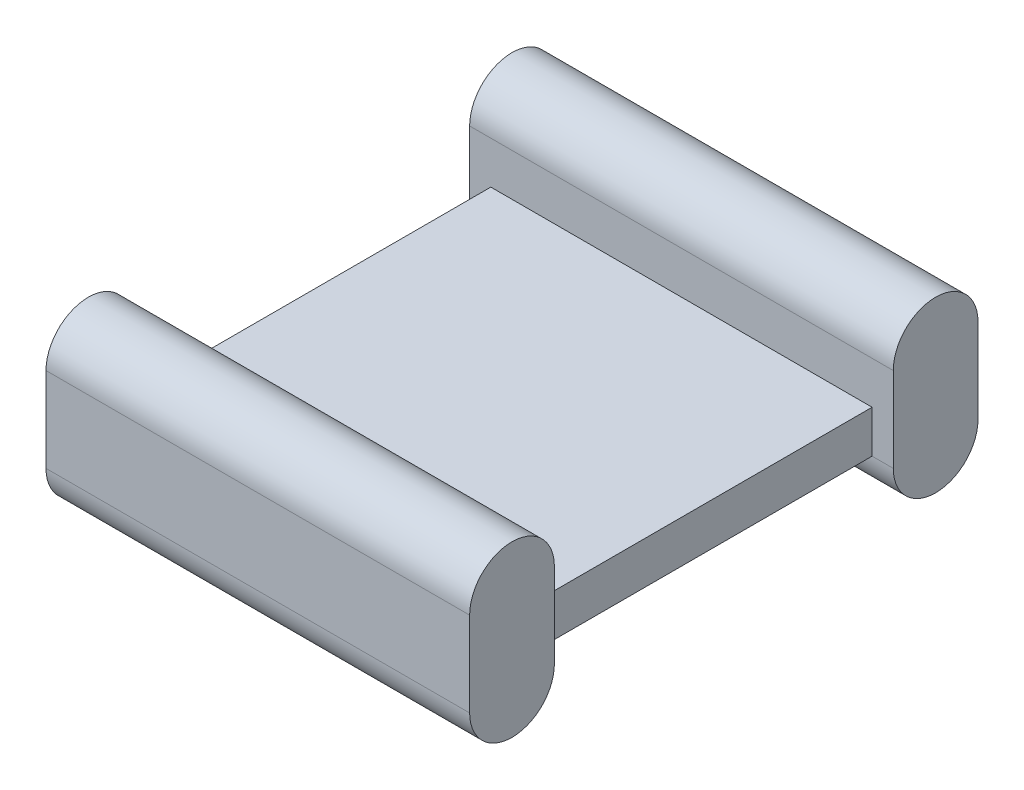
ISO-10303-21;
HEADER;
FILE_DESCRIPTION(('STEP AP214'),'2;1');
FILE_NAME('part.step','',(''),(''),'','','');
FILE_SCHEMA(('AUTOMOTIVE_DESIGN { 1 0 10303 214 1 1 1 1 }'));
ENDSEC;
DATA;
#1=APPLICATION_CONTEXT('core data for automotive mechanical design processes');
#2=APPLICATION_PROTOCOL_DEFINITION('international standard','automotive_design',2000,#1);
#3=PRODUCT_CONTEXT('',#1,'mechanical');
#4=PRODUCT('Part','Part','',(#3));
#5=PRODUCT_RELATED_PRODUCT_CATEGORY('part','',(#4));
#6=PRODUCT_DEFINITION_FORMATION('','',#4);
#7=PRODUCT_DEFINITION_CONTEXT('part definition',#1,'design');
#8=PRODUCT_DEFINITION('design','',#6,#7);
#9=PRODUCT_DEFINITION_SHAPE('','',#8);
#10=(LENGTH_UNIT() NAMED_UNIT(*) SI_UNIT(.MILLI.,.METRE.));
#11=(NAMED_UNIT(*) PLANE_ANGLE_UNIT() SI_UNIT($,.RADIAN.));
#12=(NAMED_UNIT(*) SI_UNIT($,.STERADIAN.) SOLID_ANGLE_UNIT());
#13=UNCERTAINTY_MEASURE_WITH_UNIT(LENGTH_MEASURE(1.E-05),#10,'distance_accuracy_value','');
#14=(GEOMETRIC_REPRESENTATION_CONTEXT(3) GLOBAL_UNCERTAINTY_ASSIGNED_CONTEXT((#13)) GLOBAL_UNIT_ASSIGNED_CONTEXT((#10,
#11,#12)) REPRESENTATION_CONTEXT('',''));
#15=CARTESIAN_POINT('',(0.,0.,0.));
#16=DIRECTION('',(0.,0.,1.));
#17=DIRECTION('',(1.,0.,0.));
#18=AXIS2_PLACEMENT_3D('',#15,#16,#17);
#19=CARTESIAN_POINT('',(-114.3,12.7,152.4));
#20=DIRECTION('',(1.,0.,0.));
#21=DIRECTION('',(0.,0.,-1.));
#22=AXIS2_PLACEMENT_3D('',#19,#20,#21);
#23=PLANE('',#22);
#24=DIRECTION('',(0.,1.,0.));
#25=VECTOR('',#24,1.);
#26=CARTESIAN_POINT('',(-114.3,12.7,-101.6));
#27=LINE('',#26,#25);
#28=CARTESIAN_POINT('',(-114.3,-12.7,-101.6));
#29=VERTEX_POINT('',#28);
#30=CARTESIAN_POINT('',(-114.3,12.7,-101.6));
#31=VERTEX_POINT('',#30);
#32=EDGE_CURVE('E172',#29,#31,#27,.T.);
#33=ORIENTED_EDGE('',*,*,#32,.F.);
#34=DIRECTION('',(0.,0.,1.));
#35=VECTOR('',#34,1.);
#36=CARTESIAN_POINT('',(-114.3,-12.7,152.4));
#37=LINE('',#36,#35);
#38=CARTESIAN_POINT('',(-114.3,-12.7,101.6));
#39=VERTEX_POINT('',#38);
#40=EDGE_CURVE('E213',#29,#39,#37,.T.);
#41=ORIENTED_EDGE('',*,*,#40,.T.);
#42=DIRECTION('',(0.,-1.,0.));
#43=VECTOR('',#42,1.);
#44=CARTESIAN_POINT('',(-114.3,12.7,101.6));
#45=LINE('',#44,#43);
#46=CARTESIAN_POINT('',(-114.3,12.7,101.6));
#47=VERTEX_POINT('',#46);
#48=EDGE_CURVE('E210',#47,#39,#45,.T.);
#49=ORIENTED_EDGE('',*,*,#48,.F.);
#50=DIRECTION('',(0.,0.,1.));
#51=VECTOR('',#50,1.);
#52=CARTESIAN_POINT('',(-114.3,12.7,152.4));
#53=LINE('',#52,#51);
#54=EDGE_CURVE('E135',#31,#47,#53,.T.);
#55=ORIENTED_EDGE('',*,*,#54,.F.);
#56=EDGE_LOOP('',(#33,#41,#49,#55));
#57=FACE_BOUND('',#56,.T.);
#58=ADVANCED_FACE('F35',(#57),#23,.F.);
#59=CARTESIAN_POINT('',(114.3,12.7,152.4));
#60=DIRECTION('',(-1.,0.,0.));
#61=DIRECTION('',(0.,0.,1.));
#62=AXIS2_PLACEMENT_3D('',#59,#60,#61);
#63=PLANE('',#62);
#64=DIRECTION('',(0.,-1.,0.));
#65=VECTOR('',#64,1.);
#66=CARTESIAN_POINT('',(114.3,12.7,-101.6));
#67=LINE('',#66,#65);
#68=CARTESIAN_POINT('',(114.3,12.7,-101.6));
#69=VERTEX_POINT('',#68);
#70=CARTESIAN_POINT('',(114.3,-12.7,-101.6));
#71=VERTEX_POINT('',#70);
#72=EDGE_CURVE('E49',#69,#71,#67,.T.);
#73=ORIENTED_EDGE('',*,*,#72,.F.);
#74=DIRECTION('',(0.,0.,-1.));
#75=VECTOR('',#74,1.);
#76=CARTESIAN_POINT('',(114.3,12.7,152.4));
#77=LINE('',#76,#75);
#78=CARTESIAN_POINT('',(114.3,12.7,101.6));
#79=VERTEX_POINT('',#78);
#80=EDGE_CURVE('E42',#79,#69,#77,.T.);
#81=ORIENTED_EDGE('',*,*,#80,.F.);
#82=DIRECTION('',(0.,1.,0.));
#83=VECTOR('',#82,1.);
#84=CARTESIAN_POINT('',(114.3,12.7,101.6));
#85=LINE('',#84,#83);
#86=CARTESIAN_POINT('',(114.3,-12.7,101.6));
#87=VERTEX_POINT('',#86);
#88=EDGE_CURVE('E207',#87,#79,#85,.T.);
#89=ORIENTED_EDGE('',*,*,#88,.F.);
#90=DIRECTION('',(0.,0.,-1.));
#91=VECTOR('',#90,1.);
#92=CARTESIAN_POINT('',(114.3,-12.7,152.4));
#93=LINE('',#92,#91);
#94=EDGE_CURVE('E136',#87,#71,#93,.T.);
#95=ORIENTED_EDGE('',*,*,#94,.T.);
#96=EDGE_LOOP('',(#73,#81,#89,#95));
#97=FACE_BOUND('',#96,.T.);
#98=ADVANCED_FACE('F220',(#97),#63,.F.);
#99=CARTESIAN_POINT('',(0.,12.7,0.));
#100=DIRECTION('',(0.,1.,0.));
#101=DIRECTION('',(0.,0.,1.));
#102=AXIS2_PLACEMENT_3D('',#99,#100,#101);
#103=PLANE('',#102);
#104=ORIENTED_EDGE('',*,*,#80,.T.);
#105=DIRECTION('',(-1.,0.,0.));
#106=VECTOR('',#105,1.);
#107=CARTESIAN_POINT('',(0.,12.7,-101.6));
#108=LINE('',#107,#106);
#109=EDGE_CURVE('E56',#69,#31,#108,.T.);
#110=ORIENTED_EDGE('',*,*,#109,.T.);
#111=ORIENTED_EDGE('',*,*,#54,.T.);
#112=DIRECTION('',(1.,0.,0.));
#113=VECTOR('',#112,1.);
#114=CARTESIAN_POINT('',(0.,12.7,101.6));
#115=LINE('',#114,#113);
#116=EDGE_CURVE('E205',#47,#79,#115,.T.);
#117=ORIENTED_EDGE('',*,*,#116,.T.);
#118=EDGE_LOOP('',(#104,#110,#111,#117));
#119=FACE_BOUND('',#118,.T.);
#120=ADVANCED_FACE('F251',(#119),#103,.T.);
#121=CARTESIAN_POINT('',(0.,-12.7,0.));
#122=DIRECTION('',(0.,1.,0.));
#123=DIRECTION('',(0.,0.,1.));
#124=AXIS2_PLACEMENT_3D('',#121,#122,#123);
#125=PLANE('',#124);
#126=DIRECTION('',(-1.,0.,0.));
#127=VECTOR('',#126,1.);
#128=CARTESIAN_POINT('',(127.,-12.7,-101.6));
#129=LINE('',#128,#127);
#130=EDGE_CURVE('E166',#71,#29,#129,.T.);
#131=ORIENTED_EDGE('',*,*,#130,.F.);
#132=ORIENTED_EDGE('',*,*,#94,.F.);
#133=DIRECTION('',(1.,0.,0.));
#134=VECTOR('',#133,1.);
#135=CARTESIAN_POINT('',(0.,-12.7,101.6));
#136=LINE('',#135,#134);
#137=EDGE_CURVE('E11',#39,#87,#136,.T.);
#138=ORIENTED_EDGE('',*,*,#137,.F.);
#139=ORIENTED_EDGE('',*,*,#40,.F.);
#140=EDGE_LOOP('',(#131,#132,#138,#139));
#141=FACE_BOUND('',#140,.T.);
#142=ADVANCED_FACE('F227',(#141),#125,.F.);
#143=CARTESIAN_POINT('',(127.,-12.7,101.6));
#144=DIRECTION('',(0.,0.,1.));
#145=DIRECTION('',(1.,0.,0.));
#146=AXIS2_PLACEMENT_3D('',#143,#144,#145);
#147=PLANE('',#146);
#148=ORIENTED_EDGE('',*,*,#116,.F.);
#149=ORIENTED_EDGE('',*,*,#48,.T.);
#150=DIRECTION('',(-1.,0.,0.));
#151=VECTOR('',#150,1.);
#152=CARTESIAN_POINT('',(127.,-12.7,101.6));
#153=LINE('',#152,#151);
#154=CARTESIAN_POINT('',(-127.,-12.7,101.6));
#155=VERTEX_POINT('',#154);
#156=EDGE_CURVE('E201',#39,#155,#153,.T.);
#157=ORIENTED_EDGE('',*,*,#156,.T.);
#158=DIRECTION('',(0.,1.,0.));
#159=VECTOR('',#158,1.);
#160=CARTESIAN_POINT('',(-127.,-12.7,101.6));
#161=LINE('',#160,#159);
#162=CARTESIAN_POINT('',(-127.,38.1,101.6));
#163=VERTEX_POINT('',#162);
#164=EDGE_CURVE('E190',#155,#163,#161,.T.);
#165=ORIENTED_EDGE('',*,*,#164,.T.);
#166=DIRECTION('',(-1.,0.,0.));
#167=VECTOR('',#166,1.);
#168=CARTESIAN_POINT('',(127.,38.1,101.6));
#169=LINE('',#168,#167);
#170=CARTESIAN_POINT('',(127.,38.1,101.6));
#171=VERTEX_POINT('',#170);
#172=EDGE_CURVE('E198',#171,#163,#169,.T.);
#173=ORIENTED_EDGE('',*,*,#172,.F.);
#174=DIRECTION('',(0.,1.,0.));
#175=VECTOR('',#174,1.);
#176=CARTESIAN_POINT('',(127.,-12.7,101.6));
#177=LINE('',#176,#175);
#178=CARTESIAN_POINT('',(127.,-12.7,101.6));
#179=VERTEX_POINT('',#178);
#180=EDGE_CURVE('E179',#179,#171,#177,.T.);
#181=ORIENTED_EDGE('',*,*,#180,.F.);
#182=EDGE_CURVE('E202',#179,#87,#153,.T.);
#183=ORIENTED_EDGE('',*,*,#182,.T.);
#184=ORIENTED_EDGE('',*,*,#88,.T.);
#185=EDGE_LOOP('',(#148,#149,#157,#165,#173,#181,#183,#184));
#186=FACE_BOUND('',#185,.T.);
#187=ADVANCED_FACE('F288',(#186),#147,.F.);
#188=CARTESIAN_POINT('',(127.,-12.7,127.));
#189=DIRECTION('',(-1.,0.,0.));
#190=DIRECTION('',(0.,0.,1.));
#191=AXIS2_PLACEMENT_3D('',#188,#189,#190);
#192=CYLINDRICAL_SURFACE('',#191,25.4);
#193=CARTESIAN_POINT('',(-127.,-12.7,127.));
#194=DIRECTION('',(1.,0.,0.));
#195=DIRECTION('',(0.,0.,-1.));
#196=AXIS2_PLACEMENT_3D('',#193,#194,#195);
#197=CIRCLE('',#196,25.4);
#198=CARTESIAN_POINT('',(-127.,-12.7,152.4));
#199=VERTEX_POINT('',#198);
#200=EDGE_CURVE('E175',#199,#155,#197,.T.);
#201=ORIENTED_EDGE('',*,*,#200,.T.);
#202=ORIENTED_EDGE('',*,*,#156,.F.);
#203=ORIENTED_EDGE('',*,*,#137,.T.);
#204=ORIENTED_EDGE('',*,*,#182,.F.);
#205=CARTESIAN_POINT('',(127.,-12.7,127.));
#206=DIRECTION('',(1.,0.,0.));
#207=DIRECTION('',(0.,0.,-1.));
#208=AXIS2_PLACEMENT_3D('',#205,#206,#207);
#209=CIRCLE('',#208,25.4);
#210=CARTESIAN_POINT('',(127.,-12.7,152.4));
#211=VERTEX_POINT('',#210);
#212=EDGE_CURVE('E176',#211,#179,#209,.T.);
#213=ORIENTED_EDGE('',*,*,#212,.F.);
#214=DIRECTION('',(1.,0.,0.));
#215=VECTOR('',#214,1.);
#216=CARTESIAN_POINT('',(114.3,-12.7,152.4));
#217=LINE('',#216,#215);
#218=EDGE_CURVE('E217',#199,#211,#217,.T.);
#219=ORIENTED_EDGE('',*,*,#218,.F.);
#220=EDGE_LOOP('',(#201,#202,#203,#204,#213,#219));
#221=FACE_BOUND('',#220,.T.);
#222=ADVANCED_FACE('F278',(#221),#192,.T.);
#223=CARTESIAN_POINT('',(127.,38.1,127.));
#224=DIRECTION('',(-1.,0.,0.));
#225=DIRECTION('',(0.,0.,1.));
#226=AXIS2_PLACEMENT_3D('',#223,#224,#225);
#227=CYLINDRICAL_SURFACE('',#226,25.4);
#228=CARTESIAN_POINT('',(-127.,38.1,127.));
#229=DIRECTION('',(1.,0.,0.));
#230=DIRECTION('',(0.,0.,-1.));
#231=AXIS2_PLACEMENT_3D('',#228,#229,#230);
#232=CIRCLE('',#231,25.4);
#233=CARTESIAN_POINT('',(-127.,38.1,152.4));
#234=VERTEX_POINT('',#233);
#235=EDGE_CURVE('E192',#163,#234,#232,.T.);
#236=ORIENTED_EDGE('',*,*,#235,.T.);
#237=DIRECTION('',(-1.,0.,0.));
#238=VECTOR('',#237,1.);
#239=CARTESIAN_POINT('',(127.,38.1,152.4));
#240=LINE('',#239,#238);
#241=CARTESIAN_POINT('',(127.,38.1,152.4));
#242=VERTEX_POINT('',#241);
#243=EDGE_CURVE('E187',#242,#234,#240,.T.);
#244=ORIENTED_EDGE('',*,*,#243,.F.);
#245=CARTESIAN_POINT('',(127.,38.1,127.));
#246=DIRECTION('',(1.,0.,0.));
#247=DIRECTION('',(0.,0.,-1.));
#248=AXIS2_PLACEMENT_3D('',#245,#246,#247);
#249=CIRCLE('',#248,25.4);
#250=EDGE_CURVE('E182',#171,#242,#249,.T.);
#251=ORIENTED_EDGE('',*,*,#250,.F.);
#252=ORIENTED_EDGE('',*,*,#172,.T.);
#253=EDGE_LOOP('',(#236,#244,#251,#252));
#254=FACE_BOUND('',#253,.T.);
#255=ADVANCED_FACE('F285',(#254),#227,.T.);
#256=CARTESIAN_POINT('',(127.,-12.7,127.));
#257=DIRECTION('',(1.,0.,0.));
#258=DIRECTION('',(0.,0.,-1.));
#259=AXIS2_PLACEMENT_3D('',#256,#257,#258);
#260=PLANE('',#259);
#261=ORIENTED_EDGE('',*,*,#212,.T.);
#262=ORIENTED_EDGE('',*,*,#180,.T.);
#263=ORIENTED_EDGE('',*,*,#250,.T.);
#264=DIRECTION('',(0.,-1.,0.));
#265=VECTOR('',#264,1.);
#266=CARTESIAN_POINT('',(127.,-12.7,152.4));
#267=LINE('',#266,#265);
#268=EDGE_CURVE('E184',#242,#211,#267,.T.);
#269=ORIENTED_EDGE('',*,*,#268,.T.);
#270=EDGE_LOOP('',(#261,#262,#263,#269));
#271=FACE_BOUND('',#270,.T.);
#272=ADVANCED_FACE('F267',(#271),#260,.T.);
#273=CARTESIAN_POINT('',(-127.,-12.7,127.));
#274=DIRECTION('',(1.,0.,0.));
#275=DIRECTION('',(0.,0.,-1.));
#276=AXIS2_PLACEMENT_3D('',#273,#274,#275);
#277=PLANE('',#276);
#278=ORIENTED_EDGE('',*,*,#200,.F.);
#279=DIRECTION('',(0.,-1.,0.));
#280=VECTOR('',#279,1.);
#281=CARTESIAN_POINT('',(-127.,-12.7,152.4));
#282=LINE('',#281,#280);
#283=EDGE_CURVE('E180',#234,#199,#282,.T.);
#284=ORIENTED_EDGE('',*,*,#283,.F.);
#285=ORIENTED_EDGE('',*,*,#235,.F.);
#286=ORIENTED_EDGE('',*,*,#164,.F.);
#287=EDGE_LOOP('',(#278,#284,#285,#286));
#288=FACE_BOUND('',#287,.T.);
#289=ADVANCED_FACE('F261',(#288),#277,.F.);
#290=CARTESIAN_POINT('',(114.3,12.7,152.4));
#291=DIRECTION('',(0.,0.,-1.));
#292=DIRECTION('',(-1.,0.,0.));
#293=AXIS2_PLACEMENT_3D('',#290,#291,#292);
#294=PLANE('',#293);
#295=ORIENTED_EDGE('',*,*,#283,.T.);
#296=ORIENTED_EDGE('',*,*,#218,.T.);
#297=ORIENTED_EDGE('',*,*,#268,.F.);
#298=ORIENTED_EDGE('',*,*,#243,.T.);
#299=EDGE_LOOP('',(#295,#296,#297,#298));
#300=FACE_BOUND('',#299,.T.);
#301=ADVANCED_FACE('F259',(#300),#294,.F.);
#302=CARTESIAN_POINT('',(127.,-12.7,-101.6));
#303=DIRECTION('',(0.,0.,-1.));
#304=DIRECTION('',(-1.,0.,0.));
#305=AXIS2_PLACEMENT_3D('',#302,#303,#304);
#306=PLANE('',#305);
#307=CARTESIAN_POINT('',(-127.,-12.7,-101.6));
#308=VERTEX_POINT('',#307);
#309=EDGE_CURVE('E158',#29,#308,#129,.T.);
#310=ORIENTED_EDGE('',*,*,#309,.F.);
#311=ORIENTED_EDGE('',*,*,#32,.T.);
#312=ORIENTED_EDGE('',*,*,#109,.F.);
#313=ORIENTED_EDGE('',*,*,#72,.T.);
#314=CARTESIAN_POINT('',(127.,-12.7,-101.6));
#315=VERTEX_POINT('',#314);
#316=EDGE_CURVE('E163',#315,#71,#129,.T.);
#317=ORIENTED_EDGE('',*,*,#316,.F.);
#318=DIRECTION('',(0.,-1.,0.));
#319=VECTOR('',#318,1.);
#320=CARTESIAN_POINT('',(127.,-12.7,-101.6));
#321=LINE('',#320,#319);
#322=CARTESIAN_POINT('',(127.,38.1,-101.6));
#323=VERTEX_POINT('',#322);
#324=EDGE_CURVE('E148',#323,#315,#321,.T.);
#325=ORIENTED_EDGE('',*,*,#324,.F.);
#326=DIRECTION('',(-1.,0.,0.));
#327=VECTOR('',#326,1.);
#328=CARTESIAN_POINT('',(127.,38.1,-101.6));
#329=LINE('',#328,#327);
#330=CARTESIAN_POINT('',(-127.,38.1,-101.6));
#331=VERTEX_POINT('',#330);
#332=EDGE_CURVE('E165',#323,#331,#329,.T.);
#333=ORIENTED_EDGE('',*,*,#332,.T.);
#334=DIRECTION('',(0.,-1.,0.));
#335=VECTOR('',#334,1.);
#336=CARTESIAN_POINT('',(-127.,-12.7,-101.6));
#337=LINE('',#336,#335);
#338=EDGE_CURVE('E150',#331,#308,#337,.T.);
#339=ORIENTED_EDGE('',*,*,#338,.T.);
#340=EDGE_LOOP('',(#310,#311,#312,#313,#317,#325,#333,#339));
#341=FACE_BOUND('',#340,.T.);
#342=ADVANCED_FACE('F225',(#341),#306,.F.);
#343=CARTESIAN_POINT('',(127.,-12.7,-127.));
#344=DIRECTION('',(-1.,0.,0.));
#345=DIRECTION('',(0.,0.,1.));
#346=AXIS2_PLACEMENT_3D('',#343,#344,#345);
#347=CYLINDRICAL_SURFACE('',#346,25.4);
#348=CARTESIAN_POINT('',(-127.,-12.7,-127.));
#349=DIRECTION('',(1.,0.,0.));
#350=DIRECTION('',(0.,0.,-1.));
#351=AXIS2_PLACEMENT_3D('',#348,#349,#350);
#352=CIRCLE('',#351,25.4);
#353=CARTESIAN_POINT('',(-127.,-12.7,-152.4));
#354=VERTEX_POINT('',#353);
#355=EDGE_CURVE('E132',#308,#354,#352,.T.);
#356=ORIENTED_EDGE('',*,*,#355,.T.);
#357=DIRECTION('',(-1.,0.,0.));
#358=VECTOR('',#357,1.);
#359=CARTESIAN_POINT('',(114.3,-12.7,-152.4));
#360=LINE('',#359,#358);
#361=CARTESIAN_POINT('',(127.,-12.7,-152.4));
#362=VERTEX_POINT('',#361);
#363=EDGE_CURVE('E125',#362,#354,#360,.T.);
#364=ORIENTED_EDGE('',*,*,#363,.F.);
#365=CARTESIAN_POINT('',(127.,-12.7,-127.));
#366=DIRECTION('',(1.,0.,0.));
#367=DIRECTION('',(0.,0.,-1.));
#368=AXIS2_PLACEMENT_3D('',#365,#366,#367);
#369=CIRCLE('',#368,25.4);
#370=EDGE_CURVE('E130',#315,#362,#369,.T.);
#371=ORIENTED_EDGE('',*,*,#370,.F.);
#372=ORIENTED_EDGE('',*,*,#316,.T.);
#373=ORIENTED_EDGE('',*,*,#130,.T.);
#374=ORIENTED_EDGE('',*,*,#309,.T.);
#375=EDGE_LOOP('',(#356,#364,#371,#372,#373,#374));
#376=FACE_BOUND('',#375,.T.);
#377=ADVANCED_FACE('F127',(#376),#347,.T.);
#378=CARTESIAN_POINT('',(127.,38.1,-127.));
#379=DIRECTION('',(-1.,0.,0.));
#380=DIRECTION('',(0.,0.,1.));
#381=AXIS2_PLACEMENT_3D('',#378,#379,#380);
#382=CYLINDRICAL_SURFACE('',#381,25.4);
#383=CARTESIAN_POINT('',(-127.,38.1,-127.));
#384=DIRECTION('',(1.,0.,0.));
#385=DIRECTION('',(0.,0.,-1.));
#386=AXIS2_PLACEMENT_3D('',#383,#384,#385);
#387=CIRCLE('',#386,25.4);
#388=CARTESIAN_POINT('',(-127.,38.1,-152.4));
#389=VERTEX_POINT('',#388);
#390=EDGE_CURVE('E153',#389,#331,#387,.T.);
#391=ORIENTED_EDGE('',*,*,#390,.T.);
#392=ORIENTED_EDGE('',*,*,#332,.F.);
#393=CARTESIAN_POINT('',(127.,38.1,-127.));
#394=DIRECTION('',(1.,0.,0.));
#395=DIRECTION('',(0.,0.,-1.));
#396=AXIS2_PLACEMENT_3D('',#393,#394,#395);
#397=CIRCLE('',#396,25.4);
#398=CARTESIAN_POINT('',(127.,38.1,-152.4));
#399=VERTEX_POINT('',#398);
#400=EDGE_CURVE('E144',#399,#323,#397,.T.);
#401=ORIENTED_EDGE('',*,*,#400,.F.);
#402=DIRECTION('',(-1.,0.,0.));
#403=VECTOR('',#402,1.);
#404=CARTESIAN_POINT('',(127.,38.1,-152.4));
#405=LINE('',#404,#403);
#406=EDGE_CURVE('E141',#399,#389,#405,.T.);
#407=ORIENTED_EDGE('',*,*,#406,.T.);
#408=EDGE_LOOP('',(#391,#392,#401,#407));
#409=FACE_BOUND('',#408,.T.);
#410=ADVANCED_FACE('F237',(#409),#382,.T.);
#411=CARTESIAN_POINT('',(127.,-12.7,-127.));
#412=DIRECTION('',(1.,0.,0.));
#413=DIRECTION('',(0.,0.,-1.));
#414=AXIS2_PLACEMENT_3D('',#411,#412,#413);
#415=PLANE('',#414);
#416=ORIENTED_EDGE('',*,*,#370,.T.);
#417=DIRECTION('',(0.,1.,0.));
#418=VECTOR('',#417,1.);
#419=CARTESIAN_POINT('',(127.,-12.7,-152.4));
#420=LINE('',#419,#418);
#421=EDGE_CURVE('E138',#362,#399,#420,.T.);
#422=ORIENTED_EDGE('',*,*,#421,.T.);
#423=ORIENTED_EDGE('',*,*,#400,.T.);
#424=ORIENTED_EDGE('',*,*,#324,.T.);
#425=EDGE_LOOP('',(#416,#422,#423,#424));
#426=FACE_BOUND('',#425,.T.);
#427=ADVANCED_FACE('F146',(#426),#415,.T.);
#428=CARTESIAN_POINT('',(-127.,-12.7,-127.));
#429=DIRECTION('',(1.,0.,0.));
#430=DIRECTION('',(0.,0.,-1.));
#431=AXIS2_PLACEMENT_3D('',#428,#429,#430);
#432=PLANE('',#431);
#433=ORIENTED_EDGE('',*,*,#355,.F.);
#434=ORIENTED_EDGE('',*,*,#338,.F.);
#435=ORIENTED_EDGE('',*,*,#390,.F.);
#436=DIRECTION('',(0.,1.,0.));
#437=VECTOR('',#436,1.);
#438=CARTESIAN_POINT('',(-127.,-12.7,-152.4));
#439=LINE('',#438,#437);
#440=EDGE_CURVE('E160',#354,#389,#439,.T.);
#441=ORIENTED_EDGE('',*,*,#440,.F.);
#442=EDGE_LOOP('',(#433,#434,#435,#441));
#443=FACE_BOUND('',#442,.T.);
#444=ADVANCED_FACE('F235',(#443),#432,.F.);
#445=CARTESIAN_POINT('',(114.3,12.7,-152.4));
#446=DIRECTION('',(0.,0.,1.));
#447=DIRECTION('',(1.,0.,0.));
#448=AXIS2_PLACEMENT_3D('',#445,#446,#447);
#449=PLANE('',#448);
#450=ORIENTED_EDGE('',*,*,#363,.T.);
#451=ORIENTED_EDGE('',*,*,#440,.T.);
#452=ORIENTED_EDGE('',*,*,#406,.F.);
#453=ORIENTED_EDGE('',*,*,#421,.F.);
#454=EDGE_LOOP('',(#450,#451,#452,#453));
#455=FACE_BOUND('',#454,.T.);
#456=ADVANCED_FACE('F139',(#455),#449,.F.);
#457=CLOSED_SHELL('',(#58,#98,#120,#142,#187,#222,#255,#272,#289,#301,#342,#377,#410,#427,#444,#456));
#458=MANIFOLD_SOLID_BREP('B2',#457);
#459=ADVANCED_BREP_SHAPE_REPRESENTATION('',(#18,#458),#14);
#460=SHAPE_DEFINITION_REPRESENTATION(#9,#459);
ENDSEC;
END-ISO-10303-21;
